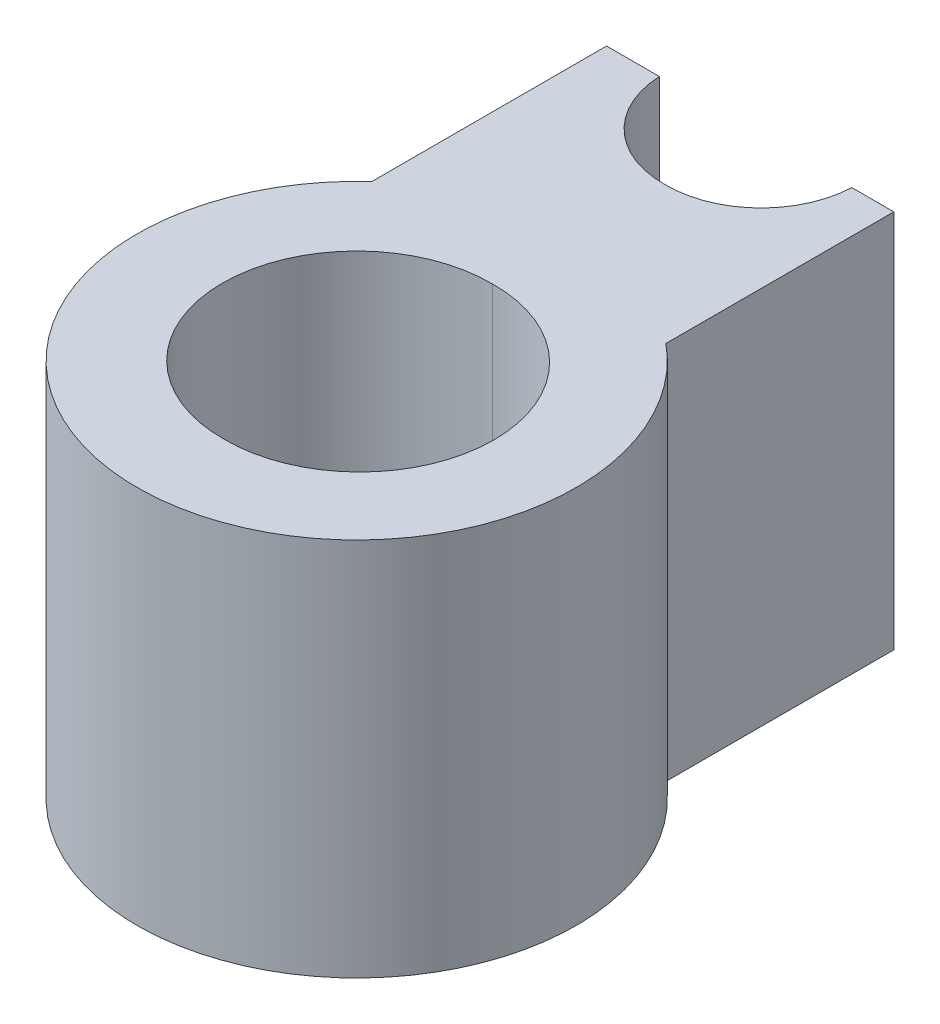
ISO-10303-21;
HEADER;
FILE_DESCRIPTION(('STEP AP214'),'2;1');
FILE_NAME('part.step','',(''),(''),'','','');
FILE_SCHEMA(('AUTOMOTIVE_DESIGN { 1 0 10303 214 1 1 1 1 }'));
ENDSEC;
DATA;
#1=APPLICATION_CONTEXT('core data for automotive mechanical design processes');
#2=APPLICATION_PROTOCOL_DEFINITION('international standard','automotive_design',2000,#1);
#3=PRODUCT_CONTEXT('',#1,'mechanical');
#4=PRODUCT('Part','Part','',(#3));
#5=PRODUCT_RELATED_PRODUCT_CATEGORY('part','',(#4));
#6=PRODUCT_DEFINITION_FORMATION('','',#4);
#7=PRODUCT_DEFINITION_CONTEXT('part definition',#1,'design');
#8=PRODUCT_DEFINITION('design','',#6,#7);
#9=PRODUCT_DEFINITION_SHAPE('','',#8);
#10=(LENGTH_UNIT() NAMED_UNIT(*) SI_UNIT(.MILLI.,.METRE.));
#11=(NAMED_UNIT(*) PLANE_ANGLE_UNIT() SI_UNIT($,.RADIAN.));
#12=(NAMED_UNIT(*) SI_UNIT($,.STERADIAN.) SOLID_ANGLE_UNIT());
#13=UNCERTAINTY_MEASURE_WITH_UNIT(LENGTH_MEASURE(1.E-05),#10,'distance_accuracy_value','');
#14=(GEOMETRIC_REPRESENTATION_CONTEXT(3) GLOBAL_UNCERTAINTY_ASSIGNED_CONTEXT((#13)) GLOBAL_UNIT_ASSIGNED_CONTEXT((#10,
#11,#12)) REPRESENTATION_CONTEXT('',''));
#15=CARTESIAN_POINT('',(0.,0.,0.));
#16=DIRECTION('',(0.,0.,1.));
#17=DIRECTION('',(1.,0.,0.));
#18=AXIS2_PLACEMENT_3D('',#15,#16,#17);
#19=CARTESIAN_POINT('',(1.26536763995187,2.87183105039429,15.59112871048));
#20=DIRECTION('',(0.,1.,0.));
#21=DIRECTION('',(0.,0.,-1.));
#22=AXIS2_PLACEMENT_3D('',#19,#20,#21);
#23=PLANE('',#22);
#24=CARTESIAN_POINT('',(3.71646763995187,2.87183105039428,7.9584287104753));
#25=DIRECTION('',(0.,1.,0.));
#26=DIRECTION('',(0.,0.,1.));
#27=AXIS2_PLACEMENT_3D('',#24,#25,#26);
#28=CIRCLE('',#27,0.425);
#29=CARTESIAN_POINT('',(3.71185108257123,2.87183105039428,8.38340363608618));
#30=VERTEX_POINT('',#29);
#31=CARTESIAN_POINT('',(3.71185108257123,2.87183105039428,7.53345378486442));
#32=VERTEX_POINT('',#31);
#33=EDGE_CURVE('E147',#30,#32,#28,.T.);
#34=ORIENTED_EDGE('',*,*,#33,.F.);
#35=CARTESIAN_POINT('',(3.70723452519211,2.87183105039428,7.9584287104753));
#36=DIRECTION('',(0.,1.,0.));
#37=DIRECTION('',(0.,0.,1.));
#38=AXIS2_PLACEMENT_3D('',#35,#36,#37);
#39=CIRCLE('',#38,0.425);
#40=EDGE_CURVE('E117',#32,#30,#39,.T.);
#41=ORIENTED_EDGE('',*,*,#40,.F.);
#42=EDGE_LOOP('',(#34,#41));
#43=FACE_BOUND('',#42,.T.);
#44=DIRECTION('',(-5.02522919053297E-13,0.,1.));
#45=VECTOR('',#44,1.);
#46=CARTESIAN_POINT('',(3.24041972130948,2.87183105039428,6.70112871047543));
#47=LINE('',#46,#45);
#48=CARTESIAN_POINT('',(3.24041972130948,2.87183105039428,6.70112871047543));
#49=VERTEX_POINT('',#48);
#50=CARTESIAN_POINT('',(3.2404197213091,2.87183105039428,7.44378108328629));
#51=VERTEX_POINT('',#50);
#52=EDGE_CURVE('E177',#49,#51,#47,.T.);
#53=ORIENTED_EDGE('',*,*,#52,.T.);
#54=CARTESIAN_POINT('',(3.70723452519211,2.87183105039428,7.9584287104753));
#55=DIRECTION('',(0.,1.,0.));
#56=DIRECTION('',(0.,0.,1.));
#57=AXIS2_PLACEMENT_3D('',#54,#55,#56);
#58=CIRCLE('',#57,0.694822453073876);
#59=CARTESIAN_POINT('',(4.14911361407159,2.87183105039428,7.42221875895757));
#60=VERTEX_POINT('',#59);
#61=EDGE_CURVE('E116',#51,#60,#58,.T.);
#62=ORIENTED_EDGE('',*,*,#61,.T.);
#63=DIRECTION('',(5.6636748734305E-13,0.,1.));
#64=VECTOR('',#63,1.);
#65=CARTESIAN_POINT('',(4.14911361407118,2.87183105039428,6.70112871047504));
#66=LINE('',#65,#64);
#67=CARTESIAN_POINT('',(4.14911361407118,2.87183105039428,6.70112871047504));
#68=VERTEX_POINT('',#67);
#69=EDGE_CURVE('E25',#68,#60,#66,.T.);
#70=ORIENTED_EDGE('',*,*,#69,.F.);
#71=DIRECTION('',(-1.,0.,1.62432664225037E-12));
#72=VECTOR('',#71,1.);
#73=CARTESIAN_POINT('',(4.14911361407118,2.87183105039428,6.70112871047504));
#74=LINE('',#73,#72);
#75=CARTESIAN_POINT('',(4.01619870275187,2.87183105039428,6.70112871047526));
#76=VERTEX_POINT('',#75);
#77=EDGE_CURVE('E11',#68,#76,#74,.T.);
#78=ORIENTED_EDGE('',*,*,#77,.T.);
#79=CARTESIAN_POINT('',(3.71646763995186,2.87183105039428,6.68842871047528));
#80=DIRECTION('',(0.,1.,0.));
#81=DIRECTION('',(-0.999103542626009,0.,0.0423333333457055));
#82=AXIS2_PLACEMENT_3D('',#79,#80,#81);
#83=CIRCLE('',#82,0.299999999999993);
#84=CARTESIAN_POINT('',(3.71185108257494,2.87183105039428,6.98839318736866));
#85=VERTEX_POINT('',#84);
#86=EDGE_CURVE('E158',#85,#76,#83,.T.);
#87=ORIENTED_EDGE('',*,*,#86,.F.);
#88=CARTESIAN_POINT('',(3.7072345251921,2.87183105039428,6.68842871047528));
#89=DIRECTION('',(0.,1.,0.));
#90=DIRECTION('',(-0.999103542626486,0.,0.0423333333344553));
#91=AXIS2_PLACEMENT_3D('',#88,#89,#90);
#92=CIRCLE('',#91,0.299999999999992);
#93=CARTESIAN_POINT('',(3.40750346240416,2.87183105039428,6.70112871047561));
#94=VERTEX_POINT('',#93);
#95=EDGE_CURVE('E166',#94,#85,#92,.T.);
#96=ORIENTED_EDGE('',*,*,#95,.F.);
#97=DIRECTION('',(1.,0.,1.06337566312106E-12));
#98=VECTOR('',#97,1.);
#99=CARTESIAN_POINT('',(3.24041972130948,2.87183105039428,6.70112871047543));
#100=LINE('',#99,#98);
#101=EDGE_CURVE('E172',#49,#94,#100,.T.);
#102=ORIENTED_EDGE('',*,*,#101,.F.);
#103=EDGE_LOOP('',(#53,#62,#70,#78,#87,#96,#102));
#104=FACE_BOUND('',#103,.T.);
#105=ADVANCED_FACE('F17',(#43,#104),#23,.T.);
#106=CARTESIAN_POINT('',(4.01619870275187,2.87183105039428,6.70112871047526));
#107=DIRECTION('',(-1.62432664225037E-12,0.,-1.));
#108=DIRECTION('',(-1.,0.,1.62432664225037E-12));
#109=AXIS2_PLACEMENT_3D('',#106,#107,#108);
#110=PLANE('',#109);
#111=DIRECTION('',(-1.,0.,1.62432664225037E-12));
#112=VECTOR('',#111,1.);
#113=CARTESIAN_POINT('',(2.64078317134465,1.6718310055699,6.70112871047749));
#114=LINE('',#113,#112);
#115=CARTESIAN_POINT('',(4.14911361407119,1.6718310055699,6.70112871047504));
#116=VERTEX_POINT('',#115);
#117=CARTESIAN_POINT('',(4.01619870275188,1.6718310055699,6.70112871047526));
#118=VERTEX_POINT('',#117);
#119=EDGE_CURVE('E133',#116,#118,#114,.T.);
#120=ORIENTED_EDGE('',*,*,#119,.T.);
#121=DIRECTION('',(0.,-1.,0.));
#122=VECTOR('',#121,1.);
#123=CARTESIAN_POINT('',(4.01619870275187,2.87183105039428,6.70112871047526));
#124=LINE('',#123,#122);
#125=EDGE_CURVE('E161',#76,#118,#124,.T.);
#126=ORIENTED_EDGE('',*,*,#125,.F.);
#127=ORIENTED_EDGE('',*,*,#77,.F.);
#128=DIRECTION('',(0.,-1.,0.));
#129=VECTOR('',#128,1.);
#130=CARTESIAN_POINT('',(4.14911361407118,2.87183105039428,6.70112871047504));
#131=LINE('',#130,#129);
#132=EDGE_CURVE('E185',#68,#116,#131,.T.);
#133=ORIENTED_EDGE('',*,*,#132,.T.);
#134=EDGE_LOOP('',(#120,#126,#127,#133));
#135=FACE_BOUND('',#134,.T.);
#136=ADVANCED_FACE('F299',(#135),#110,.T.);
#137=CARTESIAN_POINT('',(4.14911361407118,2.87183105039428,6.70112871047504));
#138=DIRECTION('',(1.,0.,-5.6636748734305E-13));
#139=DIRECTION('',(-5.6636748734305E-13,0.,-1.));
#140=AXIS2_PLACEMENT_3D('',#137,#138,#139);
#141=PLANE('',#140);
#142=DIRECTION('',(-5.6636748734305E-13,0.,-1.));
#143=VECTOR('',#142,1.);
#144=CARTESIAN_POINT('',(4.14911361407369,1.6718310055699,11.1461287104767));
#145=LINE('',#144,#143);
#146=CARTESIAN_POINT('',(4.14911361407159,1.6718310055699,7.42221875895757));
#147=VERTEX_POINT('',#146);
#148=EDGE_CURVE('E112',#147,#116,#145,.T.);
#149=ORIENTED_EDGE('',*,*,#148,.T.);
#150=ORIENTED_EDGE('',*,*,#132,.F.);
#151=ORIENTED_EDGE('',*,*,#69,.T.);
#152=DIRECTION('',(0.,-1.,0.));
#153=VECTOR('',#152,1.);
#154=CARTESIAN_POINT('',(4.14911361407159,2.87183105039428,7.42221875895757));
#155=LINE('',#154,#153);
#156=EDGE_CURVE('E108',#60,#147,#155,.T.);
#157=ORIENTED_EDGE('',*,*,#156,.T.);
#158=EDGE_LOOP('',(#149,#150,#151,#157));
#159=FACE_BOUND('',#158,.T.);
#160=ADVANCED_FACE('F110',(#159),#141,.T.);
#161=CARTESIAN_POINT('',(3.70723452519211,2.87183105039428,7.9584287104753));
#162=DIRECTION('',(0.,-1.,0.));
#163=DIRECTION('',(0.,0.,1.));
#164=AXIS2_PLACEMENT_3D('',#161,#162,#163);
#165=CYLINDRICAL_SURFACE('',#164,0.694822453073876);
#166=CARTESIAN_POINT('',(3.70723452519211,1.6718310055699,7.9584287104753));
#167=DIRECTION('',(0.,1.,0.));
#168=DIRECTION('',(0.,0.,1.));
#169=AXIS2_PLACEMENT_3D('',#166,#167,#168);
#170=CIRCLE('',#169,0.694822453073876);
#171=CARTESIAN_POINT('',(3.24041972130911,1.6718310055699,7.44378108328629));
#172=VERTEX_POINT('',#171);
#173=EDGE_CURVE('E120',#172,#147,#170,.T.);
#174=ORIENTED_EDGE('',*,*,#173,.T.);
#175=ORIENTED_EDGE('',*,*,#156,.F.);
#176=ORIENTED_EDGE('',*,*,#61,.F.);
#177=DIRECTION('',(0.,-1.,0.));
#178=VECTOR('',#177,1.);
#179=CARTESIAN_POINT('',(3.2404197213091,2.87183105039428,7.44378108328629));
#180=LINE('',#179,#178);
#181=EDGE_CURVE('E123',#51,#172,#180,.T.);
#182=ORIENTED_EDGE('',*,*,#181,.T.);
#183=EDGE_LOOP('',(#174,#175,#176,#182));
#184=FACE_BOUND('',#183,.T.);
#185=ADVANCED_FACE('F121',(#184),#165,.T.);
#186=CARTESIAN_POINT('',(3.70723452519211,2.87183105039428,7.9584287104753));
#187=DIRECTION('',(0.,-1.,0.));
#188=DIRECTION('',(-1.,0.,0.));
#189=AXIS2_PLACEMENT_3D('',#186,#187,#188);
#190=CYLINDRICAL_SURFACE('',#189,0.425);
#191=CARTESIAN_POINT('',(3.70723452519211,1.6718310055699,7.9584287104753));
#192=DIRECTION('',(0.,-1.,0.));
#193=DIRECTION('',(0.,0.,1.));
#194=AXIS2_PLACEMENT_3D('',#191,#192,#193);
#195=CIRCLE('',#194,0.425);
#196=CARTESIAN_POINT('',(3.71185108257124,1.6718310055699,8.38340363608618));
#197=VERTEX_POINT('',#196);
#198=CARTESIAN_POINT('',(3.71185108257124,1.6718310055699,7.53345378486442));
#199=VERTEX_POINT('',#198);
#200=EDGE_CURVE('E148',#197,#199,#195,.T.);
#201=ORIENTED_EDGE('',*,*,#200,.T.);
#202=DIRECTION('',(0.,-1.,0.));
#203=VECTOR('',#202,1.);
#204=CARTESIAN_POINT('',(3.71185108257123,2.87183105039428,7.53345378486442));
#205=LINE('',#204,#203);
#206=EDGE_CURVE('E152',#32,#199,#205,.T.);
#207=ORIENTED_EDGE('',*,*,#206,.F.);
#208=ORIENTED_EDGE('',*,*,#40,.T.);
#209=DIRECTION('',(0.,-1.,0.));
#210=VECTOR('',#209,1.);
#211=CARTESIAN_POINT('',(3.71185108257123,2.87183105039428,8.38340363608618));
#212=LINE('',#211,#210);
#213=EDGE_CURVE('E144',#30,#197,#212,.T.);
#214=ORIENTED_EDGE('',*,*,#213,.T.);
#215=EDGE_LOOP('',(#201,#207,#208,#214));
#216=FACE_BOUND('',#215,.T.);
#217=ADVANCED_FACE('F310',(#216),#190,.F.);
#218=CARTESIAN_POINT('',(3.2404197213091,2.87183105039428,7.44378108328629));
#219=DIRECTION('',(-1.,0.,-5.02522919053297E-13));
#220=DIRECTION('',(-5.02522919053297E-13,0.,1.));
#221=AXIS2_PLACEMENT_3D('',#218,#219,#220);
#222=PLANE('',#221);
#223=DIRECTION('',(-5.02522919053297E-13,0.,1.));
#224=VECTOR('',#223,1.);
#225=CARTESIAN_POINT('',(3.24041972130706,1.6718310055699,11.5174548968836));
#226=LINE('',#225,#224);
#227=CARTESIAN_POINT('',(3.24041972130948,1.6718310055699,6.70112871047543));
#228=VERTEX_POINT('',#227);
#229=EDGE_CURVE('E277',#228,#172,#226,.T.);
#230=ORIENTED_EDGE('',*,*,#229,.T.);
#231=ORIENTED_EDGE('',*,*,#181,.F.);
#232=ORIENTED_EDGE('',*,*,#52,.F.);
#233=DIRECTION('',(0.,-1.,0.));
#234=VECTOR('',#233,1.);
#235=CARTESIAN_POINT('',(3.24041972130948,2.87183105039428,6.70112871047543));
#236=LINE('',#235,#234);
#237=EDGE_CURVE('E169',#49,#228,#236,.T.);
#238=ORIENTED_EDGE('',*,*,#237,.T.);
#239=EDGE_LOOP('',(#230,#231,#232,#238));
#240=FACE_BOUND('',#239,.T.);
#241=ADVANCED_FACE('F314',(#240),#222,.T.);
#242=CARTESIAN_POINT('',(3.24041972130948,2.87183105039428,6.70112871047543));
#243=DIRECTION('',(1.06337566312106E-12,0.,-1.));
#244=DIRECTION('',(0.,-1.,0.));
#245=AXIS2_PLACEMENT_3D('',#242,#243,#244);
#246=PLANE('',#245);
#247=DIRECTION('',(-1.,0.,-1.06337566312106E-12));
#248=VECTOR('',#247,1.);
#249=CARTESIAN_POINT('',(2.2528936806354,1.6718310055699,6.70112871047438));
#250=LINE('',#249,#248);
#251=CARTESIAN_POINT('',(3.40750346240417,1.6718310055699,6.70112871047561));
#252=VERTEX_POINT('',#251);
#253=EDGE_CURVE('E270',#252,#228,#250,.T.);
#254=ORIENTED_EDGE('',*,*,#253,.T.);
#255=ORIENTED_EDGE('',*,*,#237,.F.);
#256=ORIENTED_EDGE('',*,*,#101,.T.);
#257=DIRECTION('',(0.,-1.,0.));
#258=VECTOR('',#257,1.);
#259=CARTESIAN_POINT('',(3.40750346240416,2.87183105039428,6.70112871047561));
#260=LINE('',#259,#258);
#261=EDGE_CURVE('E163',#94,#252,#260,.T.);
#262=ORIENTED_EDGE('',*,*,#261,.T.);
#263=EDGE_LOOP('',(#254,#255,#256,#262));
#264=FACE_BOUND('',#263,.T.);
#265=ADVANCED_FACE('F318',(#264),#246,.T.);
#266=CARTESIAN_POINT('',(3.7072345251921,2.87183105039428,6.68842871047528));
#267=DIRECTION('',(0.,-1.,0.));
#268=DIRECTION('',(-0.999103542626486,0.,0.0423333333344553));
#269=AXIS2_PLACEMENT_3D('',#266,#267,#268);
#270=CYLINDRICAL_SURFACE('',#269,0.299999999999992);
#271=CARTESIAN_POINT('',(3.7072345251921,1.6718310055699,6.68842871047528));
#272=DIRECTION('',(0.,-1.,0.));
#273=DIRECTION('',(-0.999103542626486,0.,0.0423333333344553));
#274=AXIS2_PLACEMENT_3D('',#271,#272,#273);
#275=CIRCLE('',#274,0.299999999999992);
#276=CARTESIAN_POINT('',(3.71185108257495,1.6718310055699,6.98839318736866));
#277=VERTEX_POINT('',#276);
#278=EDGE_CURVE('E265',#277,#252,#275,.T.);
#279=ORIENTED_EDGE('',*,*,#278,.T.);
#280=ORIENTED_EDGE('',*,*,#261,.F.);
#281=ORIENTED_EDGE('',*,*,#95,.T.);
#282=DIRECTION('',(0.,-1.,0.));
#283=VECTOR('',#282,1.);
#284=CARTESIAN_POINT('',(3.71185108257494,2.87183105039428,6.98839318736866));
#285=LINE('',#284,#283);
#286=EDGE_CURVE('E155',#85,#277,#285,.T.);
#287=ORIENTED_EDGE('',*,*,#286,.T.);
#288=EDGE_LOOP('',(#279,#280,#281,#287));
#289=FACE_BOUND('',#288,.T.);
#290=ADVANCED_FACE('F294',(#289),#270,.F.);
#291=CARTESIAN_POINT('',(3.71646763995186,2.87183105039428,6.68842871047528));
#292=DIRECTION('',(0.,-1.,0.));
#293=DIRECTION('',(-0.999103542626009,0.,0.0423333333457054));
#294=AXIS2_PLACEMENT_3D('',#291,#292,#293);
#295=CYLINDRICAL_SURFACE('',#294,0.299999999999993);
#296=CARTESIAN_POINT('',(3.71646763995186,1.6718310055699,6.68842871047528));
#297=DIRECTION('',(0.,-1.,0.));
#298=DIRECTION('',(-0.999103542626009,0.,0.0423333333457055));
#299=AXIS2_PLACEMENT_3D('',#296,#297,#298);
#300=CIRCLE('',#299,0.299999999999993);
#301=EDGE_CURVE('E140',#118,#277,#300,.T.);
#302=ORIENTED_EDGE('',*,*,#301,.T.);
#303=ORIENTED_EDGE('',*,*,#286,.F.);
#304=ORIENTED_EDGE('',*,*,#86,.T.);
#305=ORIENTED_EDGE('',*,*,#125,.T.);
#306=EDGE_LOOP('',(#302,#303,#304,#305));
#307=FACE_BOUND('',#306,.T.);
#308=ADVANCED_FACE('F290',(#307),#295,.F.);
#309=CARTESIAN_POINT('',(3.71646763995187,2.87183105039428,7.9584287104753));
#310=DIRECTION('',(0.,-1.,0.));
#311=DIRECTION('',(1.,0.,0.));
#312=AXIS2_PLACEMENT_3D('',#309,#310,#311);
#313=CYLINDRICAL_SURFACE('',#312,0.425);
#314=CARTESIAN_POINT('',(3.71646763995187,1.6718310055699,7.9584287104753));
#315=DIRECTION('',(0.,-1.,0.));
#316=DIRECTION('',(0.,0.,1.));
#317=AXIS2_PLACEMENT_3D('',#314,#315,#316);
#318=CIRCLE('',#317,0.425);
#319=EDGE_CURVE('E128',#199,#197,#318,.T.);
#320=ORIENTED_EDGE('',*,*,#319,.T.);
#321=ORIENTED_EDGE('',*,*,#213,.F.);
#322=ORIENTED_EDGE('',*,*,#33,.T.);
#323=ORIENTED_EDGE('',*,*,#206,.T.);
#324=EDGE_LOOP('',(#320,#321,#322,#323));
#325=FACE_BOUND('',#324,.T.);
#326=ADVANCED_FACE('F326',(#325),#313,.F.);
#327=CARTESIAN_POINT('',(1.26536763995188,1.6718310055699,15.59112871048));
#328=DIRECTION('',(0.,1.,0.));
#329=DIRECTION('',(0.,0.,-1.));
#330=AXIS2_PLACEMENT_3D('',#327,#328,#329);
#331=PLANE('',#330);
#332=ORIENTED_EDGE('',*,*,#319,.F.);
#333=ORIENTED_EDGE('',*,*,#200,.F.);
#334=EDGE_LOOP('',(#332,#333));
#335=FACE_BOUND('',#334,.T.);
#336=ORIENTED_EDGE('',*,*,#229,.F.);
#337=ORIENTED_EDGE('',*,*,#253,.F.);
#338=ORIENTED_EDGE('',*,*,#278,.F.);
#339=ORIENTED_EDGE('',*,*,#301,.F.);
#340=ORIENTED_EDGE('',*,*,#119,.F.);
#341=ORIENTED_EDGE('',*,*,#148,.F.);
#342=ORIENTED_EDGE('',*,*,#173,.F.);
#343=EDGE_LOOP('',(#336,#337,#338,#339,#340,#341,#342));
#344=FACE_BOUND('',#343,.T.);
#345=ADVANCED_FACE('F130',(#335,#344),#331,.F.);
#346=CLOSED_SHELL('',(#105,#136,#160,#185,#217,#241,#265,#290,#308,#326,#345));
#347=MANIFOLD_SOLID_BREP('B1',#346);
#348=ADVANCED_BREP_SHAPE_REPRESENTATION('',(#18,#347),#14);
#349=SHAPE_DEFINITION_REPRESENTATION(#9,#348);
ENDSEC;
END-ISO-10303-21;
